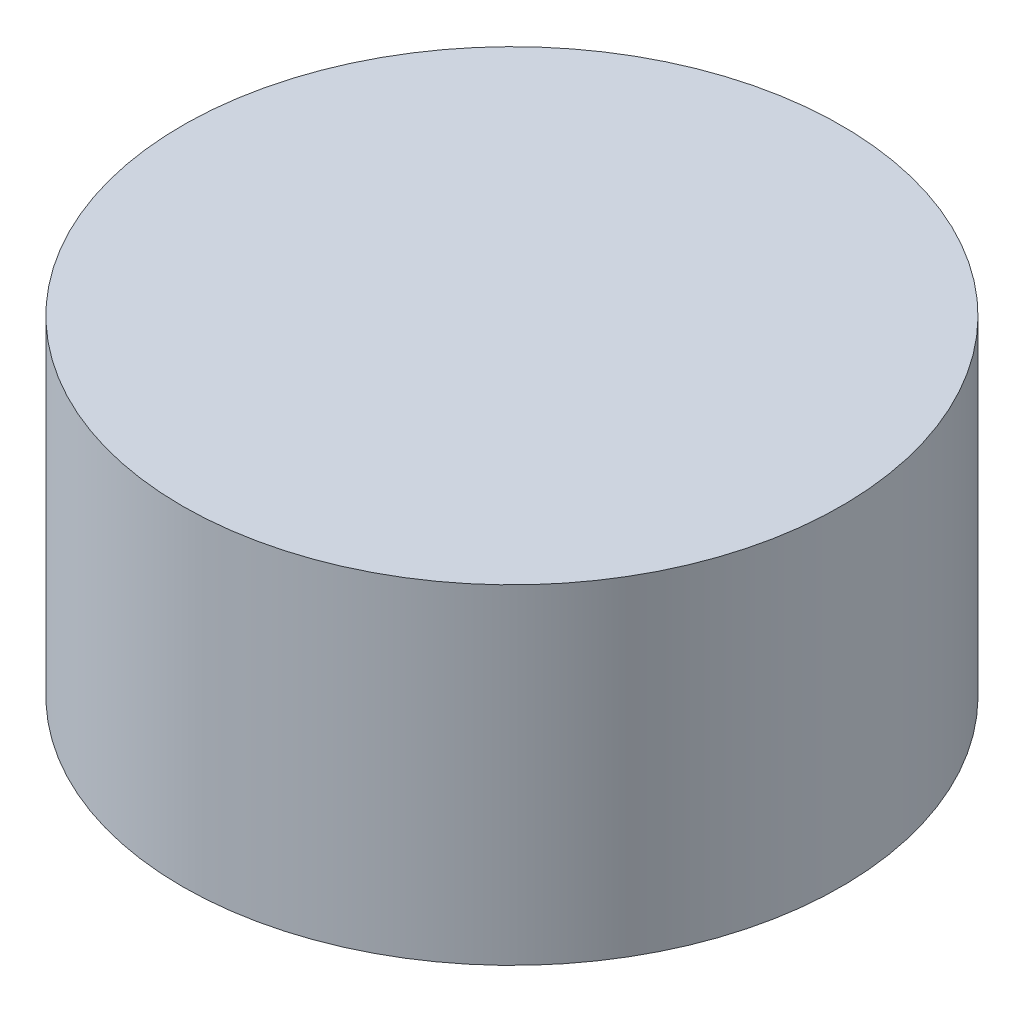
ISO-10303-21;
HEADER;
FILE_DESCRIPTION(('STEP AP214'),'2;1');
FILE_NAME('part.step','',(''),(''),'','','');
FILE_SCHEMA(('AUTOMOTIVE_DESIGN { 1 0 10303 214 1 1 1 1 }'));
ENDSEC;
DATA;
#1=APPLICATION_CONTEXT('core data for automotive mechanical design processes');
#2=APPLICATION_PROTOCOL_DEFINITION('international standard','automotive_design',2000,#1);
#3=PRODUCT_CONTEXT('',#1,'mechanical');
#4=PRODUCT('Part','Part','',(#3));
#5=PRODUCT_RELATED_PRODUCT_CATEGORY('part','',(#4));
#6=PRODUCT_DEFINITION_FORMATION('','',#4);
#7=PRODUCT_DEFINITION_CONTEXT('part definition',#1,'design');
#8=PRODUCT_DEFINITION('design','',#6,#7);
#9=PRODUCT_DEFINITION_SHAPE('','',#8);
#10=(LENGTH_UNIT() NAMED_UNIT(*) SI_UNIT(.MILLI.,.METRE.));
#11=(NAMED_UNIT(*) PLANE_ANGLE_UNIT() SI_UNIT($,.RADIAN.));
#12=(NAMED_UNIT(*) SI_UNIT($,.STERADIAN.) SOLID_ANGLE_UNIT());
#13=UNCERTAINTY_MEASURE_WITH_UNIT(LENGTH_MEASURE(1.E-05),#10,'distance_accuracy_value','');
#14=(GEOMETRIC_REPRESENTATION_CONTEXT(3) GLOBAL_UNCERTAINTY_ASSIGNED_CONTEXT((#13)) GLOBAL_UNIT_ASSIGNED_CONTEXT((#10,
#11,#12)) REPRESENTATION_CONTEXT('',''));
#15=CARTESIAN_POINT('',(0.,0.,0.));
#16=DIRECTION('',(0.,0.,1.));
#17=DIRECTION('',(1.,0.,0.));
#18=AXIS2_PLACEMENT_3D('',#15,#16,#17);
#19=CARTESIAN_POINT('',(0.,3.,0.));
#20=DIRECTION('',(0.,-1.,0.));
#21=DIRECTION('',(0.,0.,-1.));
#22=AXIS2_PLACEMENT_3D('',#19,#20,#21);
#23=CYLINDRICAL_SURFACE('',#22,3.);
#24=CARTESIAN_POINT('',(0.,3.,0.));
#25=DIRECTION('',(0.,1.,0.));
#26=DIRECTION('',(0.,0.,1.));
#27=AXIS2_PLACEMENT_3D('',#24,#25,#26);
#28=CIRCLE('',#27,3.);
#29=CARTESIAN_POINT('',(0.,3.,3.));
#30=VERTEX_POINT('',#29);
#31=EDGE_CURVE('E10',#30,#30,#28,.T.);
#32=ORIENTED_EDGE('',*,*,#31,.F.);
#33=EDGE_LOOP('',(#32));
#34=FACE_BOUND('',#33,.T.);
#35=CARTESIAN_POINT('',(0.,0.,0.));
#36=DIRECTION('',(0.,1.,0.));
#37=DIRECTION('',(0.,0.,1.));
#38=AXIS2_PLACEMENT_3D('',#35,#36,#37);
#39=CIRCLE('',#38,3.);
#40=CARTESIAN_POINT('',(0.,0.,3.));
#41=VERTEX_POINT('',#40);
#42=EDGE_CURVE('E42',#41,#41,#39,.T.);
#43=ORIENTED_EDGE('',*,*,#42,.T.);
#44=EDGE_LOOP('',(#43));
#45=FACE_BOUND('',#44,.T.);
#46=ADVANCED_FACE('F39',(#34,#45),#23,.T.);
#47=CARTESIAN_POINT('',(0.,3.,0.));
#48=DIRECTION('',(0.,1.,0.));
#49=DIRECTION('',(0.,0.,1.));
#50=AXIS2_PLACEMENT_3D('',#47,#48,#49);
#51=PLANE('',#50);
#52=ORIENTED_EDGE('',*,*,#31,.T.);
#53=EDGE_LOOP('',(#52));
#54=FACE_BOUND('',#53,.T.);
#55=ADVANCED_FACE('F56',(#54),#51,.T.);
#56=CARTESIAN_POINT('',(0.,0.,0.));
#57=DIRECTION('',(0.,1.,0.));
#58=DIRECTION('',(0.,0.,1.));
#59=AXIS2_PLACEMENT_3D('',#56,#57,#58);
#60=PLANE('',#59);
#61=ORIENTED_EDGE('',*,*,#42,.F.);
#62=EDGE_LOOP('',(#61));
#63=FACE_BOUND('',#62,.T.);
#64=ADVANCED_FACE('F54',(#63),#60,.F.);
#65=CLOSED_SHELL('',(#46,#55,#64));
#66=MANIFOLD_SOLID_BREP('B2',#65);
#67=ADVANCED_BREP_SHAPE_REPRESENTATION('',(#18,#66),#14);
#68=SHAPE_DEFINITION_REPRESENTATION(#9,#67);
ENDSEC;
END-ISO-10303-21;
